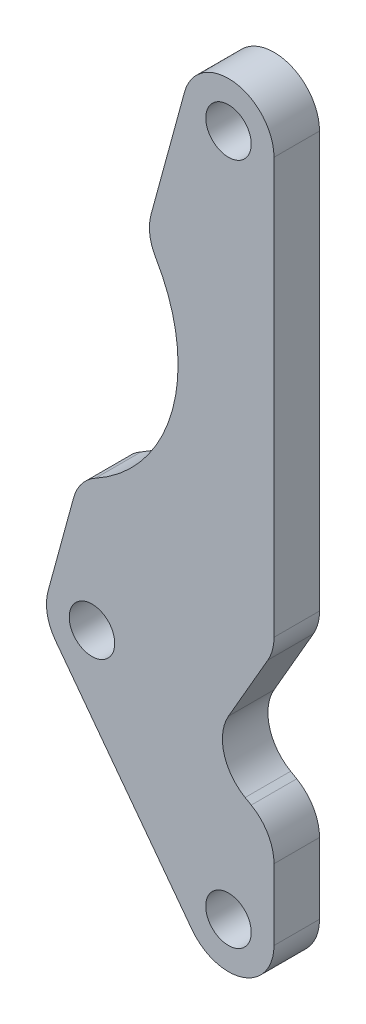
ISO-10303-21;
HEADER;
FILE_DESCRIPTION(('STEP AP214'),'2;1');
FILE_NAME('part.step','',(''),(''),'','','');
FILE_SCHEMA(('AUTOMOTIVE_DESIGN { 1 0 10303 214 1 1 1 1 }'));
ENDSEC;
DATA;
#1=APPLICATION_CONTEXT('core data for automotive mechanical design processes');
#2=APPLICATION_PROTOCOL_DEFINITION('international standard','automotive_design',2000,#1);
#3=PRODUCT_CONTEXT('',#1,'mechanical');
#4=PRODUCT('Part','Part','',(#3));
#5=PRODUCT_RELATED_PRODUCT_CATEGORY('part','',(#4));
#6=PRODUCT_DEFINITION_FORMATION('','',#4);
#7=PRODUCT_DEFINITION_CONTEXT('part definition',#1,'design');
#8=PRODUCT_DEFINITION('design','',#6,#7);
#9=PRODUCT_DEFINITION_SHAPE('','',#8);
#10=(LENGTH_UNIT() NAMED_UNIT(*) SI_UNIT(.MILLI.,.METRE.));
#11=(NAMED_UNIT(*) PLANE_ANGLE_UNIT() SI_UNIT($,.RADIAN.));
#12=(NAMED_UNIT(*) SI_UNIT($,.STERADIAN.) SOLID_ANGLE_UNIT());
#13=UNCERTAINTY_MEASURE_WITH_UNIT(LENGTH_MEASURE(1.E-05),#10,'distance_accuracy_value','');
#14=(GEOMETRIC_REPRESENTATION_CONTEXT(3) GLOBAL_UNCERTAINTY_ASSIGNED_CONTEXT((#13)) GLOBAL_UNIT_ASSIGNED_CONTEXT((#10,
#11,#12)) REPRESENTATION_CONTEXT('',''));
#15=CARTESIAN_POINT('',(0.,0.,0.));
#16=DIRECTION('',(0.,0.,1.));
#17=DIRECTION('',(1.,0.,0.));
#18=AXIS2_PLACEMENT_3D('',#15,#16,#17);
#19=CARTESIAN_POINT('',(-20.0545883369579,5.4694331828067,5.));
#20=DIRECTION('',(0.964763821237732,-0.263117405792109,0.));
#21=DIRECTION('',(0.263117405792109,0.964763821237732,0.));
#22=AXIS2_PLACEMENT_3D('',#19,#20,#21);
#23=PLANE('',#22);
#24=DIRECTION('',(-0.263117405792109,-0.964763821237732,0.));
#25=VECTOR('',#24,1.);
#26=CARTESIAN_POINT('',(-20.0545883369579,5.4694331828067,0.));
#27=LINE('',#26,#25);
#28=CARTESIAN_POINT('',(-4.82381910618866,61.3155870289606,0.));
#29=VERTEX_POINT('',#28);
#30=CARTESIAN_POINT('',(-8.51116880857213,47.7953047868878,0.));
#31=VERTEX_POINT('',#30);
#32=EDGE_CURVE('E208',#29,#31,#27,.T.);
#33=ORIENTED_EDGE('',*,*,#32,.T.);
#34=DIRECTION('',(0.,0.,1.));
#35=VECTOR('',#34,1.);
#36=CARTESIAN_POINT('',(-8.51116880857213,47.7953047868878,5.));
#37=LINE('',#36,#35);
#38=CARTESIAN_POINT('',(-8.51116880857213,47.7953047868878,5.));
#39=VERTEX_POINT('',#38);
#40=EDGE_CURVE('E11',#31,#39,#37,.T.);
#41=ORIENTED_EDGE('',*,*,#40,.T.);
#42=DIRECTION('',(-0.263117405792109,-0.964763821237732,0.));
#43=VECTOR('',#42,1.);
#44=CARTESIAN_POINT('',(-20.0545883369579,5.4694331828067,5.));
#45=LINE('',#44,#43);
#46=CARTESIAN_POINT('',(-4.82381910618866,61.3155870289606,5.));
#47=VERTEX_POINT('',#46);
#48=EDGE_CURVE('E184',#47,#39,#45,.T.);
#49=ORIENTED_EDGE('',*,*,#48,.F.);
#50=DIRECTION('',(0.,0.,-1.));
#51=VECTOR('',#50,1.);
#52=CARTESIAN_POINT('',(-4.82381910618866,61.3155870289606,5.));
#53=LINE('',#52,#51);
#54=EDGE_CURVE('E161',#47,#29,#53,.T.);
#55=ORIENTED_EDGE('',*,*,#54,.T.);
#56=EDGE_LOOP('',(#33,#41,#49,#55));
#57=FACE_BOUND('',#56,.T.);
#58=ADVANCED_FACE('F34',(#57),#23,.F.);
#59=CARTESIAN_POINT('',(5.,0.,5.));
#60=DIRECTION('',(1.,0.,0.));
#61=DIRECTION('',(0.,1.,0.));
#62=AXIS2_PLACEMENT_3D('',#59,#60,#61);
#63=PLANE('',#62);
#64=DIRECTION('',(0.,-1.,0.));
#65=VECTOR('',#64,1.);
#66=CARTESIAN_POINT('',(5.,0.,5.));
#67=LINE('',#66,#65);
#68=CARTESIAN_POINT('',(5.,60.,5.));
#69=VERTEX_POINT('',#68);
#70=CARTESIAN_POINT('',(5.,14.3301270189224,5.));
#71=VERTEX_POINT('',#70);
#72=EDGE_CURVE('E154',#69,#71,#67,.T.);
#73=ORIENTED_EDGE('',*,*,#72,.T.);
#74=DIRECTION('',(0.,0.,1.));
#75=VECTOR('',#74,1.);
#76=CARTESIAN_POINT('',(5.,14.3301270189224,0.));
#77=LINE('',#76,#75);
#78=CARTESIAN_POINT('',(5.,14.3301270189224,0.));
#79=VERTEX_POINT('',#78);
#80=EDGE_CURVE('E256',#71,#79,#77,.F.);
#81=ORIENTED_EDGE('',*,*,#80,.T.);
#82=DIRECTION('',(0.,-1.,0.));
#83=VECTOR('',#82,1.);
#84=CARTESIAN_POINT('',(5.,0.,0.));
#85=LINE('',#84,#83);
#86=CARTESIAN_POINT('',(5.,60.,0.));
#87=VERTEX_POINT('',#86);
#88=EDGE_CURVE('E157',#87,#79,#85,.T.);
#89=ORIENTED_EDGE('',*,*,#88,.F.);
#90=DIRECTION('',(0.,0.,-1.));
#91=VECTOR('',#90,1.);
#92=CARTESIAN_POINT('',(5.,60.,5.));
#93=LINE('',#92,#91);
#94=EDGE_CURVE('E150',#69,#87,#93,.T.);
#95=ORIENTED_EDGE('',*,*,#94,.F.);
#96=EDGE_LOOP('',(#73,#81,#89,#95));
#97=FACE_BOUND('',#96,.T.);
#98=ADVANCED_FACE('F152',(#97),#63,.T.);
#99=CARTESIAN_POINT('',(5.,-7.21687836487035,0.));
#100=VERTEX_POINT('',#99);
#101=CARTESIAN_POINT('',(5.,-15.,0.));
#102=VERTEX_POINT('',#101);
#103=EDGE_CURVE('E205',#100,#102,#85,.T.);
#104=ORIENTED_EDGE('',*,*,#103,.F.);
#105=DIRECTION('',(0.,0.,1.));
#106=VECTOR('',#105,1.);
#107=CARTESIAN_POINT('',(5.,-7.21687836487035,5.));
#108=LINE('',#107,#106);
#109=CARTESIAN_POINT('',(5.,-7.21687836487035,5.));
#110=VERTEX_POINT('',#109);
#111=EDGE_CURVE('E160',#100,#110,#108,.T.);
#112=ORIENTED_EDGE('',*,*,#111,.T.);
#113=CARTESIAN_POINT('',(5.,-15.,5.));
#114=VERTEX_POINT('',#113);
#115=EDGE_CURVE('E177',#110,#114,#67,.T.);
#116=ORIENTED_EDGE('',*,*,#115,.T.);
#117=DIRECTION('',(0.,0.,-1.));
#118=VECTOR('',#117,1.);
#119=CARTESIAN_POINT('',(5.,-15.,5.));
#120=LINE('',#119,#118);
#121=EDGE_CURVE('E202',#114,#102,#120,.T.);
#122=ORIENTED_EDGE('',*,*,#121,.T.);
#123=EDGE_LOOP('',(#104,#112,#116,#122));
#124=FACE_BOUND('',#123,.T.);
#125=ADVANCED_FACE('F307',(#124),#63,.T.);
#126=CARTESIAN_POINT('',(0.,60.,5.));
#127=DIRECTION('',(0.,0.,-1.));
#128=DIRECTION('',(-1.,0.,0.));
#129=AXIS2_PLACEMENT_3D('',#126,#127,#128);
#130=CYLINDRICAL_SURFACE('',#129,5.);
#131=CARTESIAN_POINT('',(0.,60.,0.));
#132=DIRECTION('',(0.,0.,1.));
#133=DIRECTION('',(1.,0.,0.));
#134=AXIS2_PLACEMENT_3D('',#131,#132,#133);
#135=CIRCLE('',#134,5.);
#136=EDGE_CURVE('E204',#87,#29,#135,.T.);
#137=ORIENTED_EDGE('',*,*,#136,.T.);
#138=ORIENTED_EDGE('',*,*,#54,.F.);
#139=CARTESIAN_POINT('',(0.,60.,5.));
#140=DIRECTION('',(0.,0.,1.));
#141=DIRECTION('',(1.,0.,0.));
#142=AXIS2_PLACEMENT_3D('',#139,#140,#141);
#143=CIRCLE('',#142,5.);
#144=EDGE_CURVE('E164',#69,#47,#143,.T.);
#145=ORIENTED_EDGE('',*,*,#144,.F.);
#146=ORIENTED_EDGE('',*,*,#94,.T.);
#147=EDGE_LOOP('',(#137,#138,#145,#146));
#148=FACE_BOUND('',#147,.T.);
#149=ADVANCED_FACE('F165',(#148),#130,.T.);
#150=CARTESIAN_POINT('',(-17.0187198954422,16.6009508016977,5.));
#151=VERTEX_POINT('',#150);
#152=CARTESIAN_POINT('',(-19.8238191061887,6.31558702896055,5.));
#153=VERTEX_POINT('',#152);
#154=EDGE_CURVE('E170',#151,#153,#45,.T.);
#155=ORIENTED_EDGE('',*,*,#154,.F.);
#156=DIRECTION('',(0.,0.,1.));
#157=VECTOR('',#156,1.);
#158=CARTESIAN_POINT('',(-17.0187198954422,16.6009508016977,5.));
#159=LINE('',#158,#157);
#160=CARTESIAN_POINT('',(-17.0187198954422,16.6009508016977,0.));
#161=VERTEX_POINT('',#160);
#162=EDGE_CURVE('E57',#151,#161,#159,.F.);
#163=ORIENTED_EDGE('',*,*,#162,.T.);
#164=CARTESIAN_POINT('',(-19.8238191061887,6.31558702896055,0.));
#165=VERTEX_POINT('',#164);
#166=EDGE_CURVE('E207',#161,#165,#27,.T.);
#167=ORIENTED_EDGE('',*,*,#166,.T.);
#168=DIRECTION('',(0.,0.,-1.));
#169=VECTOR('',#168,1.);
#170=CARTESIAN_POINT('',(-19.8238191061887,6.31558702896055,5.));
#171=LINE('',#170,#169);
#172=EDGE_CURVE('E233',#153,#165,#171,.T.);
#173=ORIENTED_EDGE('',*,*,#172,.F.);
#174=EDGE_LOOP('',(#155,#163,#167,#173));
#175=FACE_BOUND('',#174,.T.);
#176=ADVANCED_FACE('F289',(#175),#23,.F.);
#177=CARTESIAN_POINT('',(-15.,5.,5.));
#178=DIRECTION('',(0.,0.,-1.));
#179=DIRECTION('',(-1.,0.,0.));
#180=AXIS2_PLACEMENT_3D('',#177,#178,#179);
#181=CYLINDRICAL_SURFACE('',#180,5.);
#182=CARTESIAN_POINT('',(-15.,5.,0.));
#183=DIRECTION('',(0.,0.,1.));
#184=DIRECTION('',(1.,0.,0.));
#185=AXIS2_PLACEMENT_3D('',#182,#183,#184);
#186=CIRCLE('',#185,5.);
#187=CARTESIAN_POINT('',(-19.,2.,0.));
#188=VERTEX_POINT('',#187);
#189=EDGE_CURVE('E210',#165,#188,#186,.T.);
#190=ORIENTED_EDGE('',*,*,#189,.T.);
#191=DIRECTION('',(0.,0.,-1.));
#192=VECTOR('',#191,1.);
#193=CARTESIAN_POINT('',(-19.,2.,5.));
#194=LINE('',#193,#192);
#195=CARTESIAN_POINT('',(-19.,2.,5.));
#196=VERTEX_POINT('',#195);
#197=EDGE_CURVE('E230',#196,#188,#194,.T.);
#198=ORIENTED_EDGE('',*,*,#197,.F.);
#199=CARTESIAN_POINT('',(-15.,5.,5.));
#200=DIRECTION('',(0.,0.,1.));
#201=DIRECTION('',(1.,0.,0.));
#202=AXIS2_PLACEMENT_3D('',#199,#200,#201);
#203=CIRCLE('',#202,5.);
#204=EDGE_CURVE('E186',#153,#196,#203,.T.);
#205=ORIENTED_EDGE('',*,*,#204,.F.);
#206=ORIENTED_EDGE('',*,*,#172,.T.);
#207=EDGE_LOOP('',(#190,#198,#205,#206));
#208=FACE_BOUND('',#207,.T.);
#209=ADVANCED_FACE('F293',(#208),#181,.T.);
#210=CARTESIAN_POINT('',(-11.2,-8.4,5.));
#211=DIRECTION('',(0.8,0.6,0.));
#212=DIRECTION('',(-0.6,0.8,0.));
#213=AXIS2_PLACEMENT_3D('',#210,#211,#212);
#214=PLANE('',#213);
#215=DIRECTION('',(0.6,-0.8,0.));
#216=VECTOR('',#215,1.);
#217=CARTESIAN_POINT('',(-11.2,-8.4,0.));
#218=LINE('',#217,#216);
#219=CARTESIAN_POINT('',(-4.,-18.,0.));
#220=VERTEX_POINT('',#219);
#221=EDGE_CURVE('E212',#188,#220,#218,.T.);
#222=ORIENTED_EDGE('',*,*,#221,.T.);
#223=DIRECTION('',(0.,0.,-1.));
#224=VECTOR('',#223,1.);
#225=CARTESIAN_POINT('',(-4.,-18.,5.));
#226=LINE('',#225,#224);
#227=CARTESIAN_POINT('',(-4.,-18.,5.));
#228=VERTEX_POINT('',#227);
#229=EDGE_CURVE('E227',#228,#220,#226,.T.);
#230=ORIENTED_EDGE('',*,*,#229,.F.);
#231=DIRECTION('',(0.6,-0.8,0.));
#232=VECTOR('',#231,1.);
#233=CARTESIAN_POINT('',(-11.2,-8.4,5.));
#234=LINE('',#233,#232);
#235=EDGE_CURVE('E188',#196,#228,#234,.T.);
#236=ORIENTED_EDGE('',*,*,#235,.F.);
#237=ORIENTED_EDGE('',*,*,#197,.T.);
#238=EDGE_LOOP('',(#222,#230,#236,#237));
#239=FACE_BOUND('',#238,.T.);
#240=ADVANCED_FACE('F300',(#239),#214,.F.);
#241=CARTESIAN_POINT('',(-15.,5.,5.));
#242=DIRECTION('',(0.,0.,-1.));
#243=DIRECTION('',(-1.,0.,0.));
#244=AXIS2_PLACEMENT_3D('',#241,#242,#243);
#245=CYLINDRICAL_SURFACE('',#244,2.5);
#246=CARTESIAN_POINT('',(-15.,5.,5.));
#247=DIRECTION('',(0.,0.,1.));
#248=DIRECTION('',(1.,0.,0.));
#249=AXIS2_PLACEMENT_3D('',#246,#247,#248);
#250=CIRCLE('',#249,2.5);
#251=CARTESIAN_POINT('',(-12.5,5.,5.));
#252=VERTEX_POINT('',#251);
#253=EDGE_CURVE('E196',#252,#252,#250,.T.);
#254=ORIENTED_EDGE('',*,*,#253,.T.);
#255=EDGE_LOOP('',(#254));
#256=FACE_BOUND('',#255,.T.);
#257=CARTESIAN_POINT('',(-15.,5.,0.));
#258=DIRECTION('',(0.,0.,1.));
#259=DIRECTION('',(1.,0.,0.));
#260=AXIS2_PLACEMENT_3D('',#257,#258,#259);
#261=CIRCLE('',#260,2.5);
#262=CARTESIAN_POINT('',(-12.5,5.,0.));
#263=VERTEX_POINT('',#262);
#264=EDGE_CURVE('E220',#263,#263,#261,.T.);
#265=ORIENTED_EDGE('',*,*,#264,.F.);
#266=EDGE_LOOP('',(#265));
#267=FACE_BOUND('',#266,.T.);
#268=ADVANCED_FACE('F381',(#256,#267),#245,.F.);
#269=CARTESIAN_POINT('',(0.,-15.,5.));
#270=DIRECTION('',(0.,0.,-1.));
#271=DIRECTION('',(-1.,0.,0.));
#272=AXIS2_PLACEMENT_3D('',#269,#270,#271);
#273=CYLINDRICAL_SURFACE('',#272,2.5);
#274=CARTESIAN_POINT('',(0.,-15.,5.));
#275=DIRECTION('',(0.,0.,1.));
#276=DIRECTION('',(1.,0.,0.));
#277=AXIS2_PLACEMENT_3D('',#274,#275,#276);
#278=CIRCLE('',#277,2.5);
#279=CARTESIAN_POINT('',(2.5,-15.,5.));
#280=VERTEX_POINT('',#279);
#281=EDGE_CURVE('E193',#280,#280,#278,.T.);
#282=ORIENTED_EDGE('',*,*,#281,.T.);
#283=EDGE_LOOP('',(#282));
#284=FACE_BOUND('',#283,.T.);
#285=CARTESIAN_POINT('',(0.,-15.,0.));
#286=DIRECTION('',(0.,0.,1.));
#287=DIRECTION('',(1.,0.,0.));
#288=AXIS2_PLACEMENT_3D('',#285,#286,#287);
#289=CIRCLE('',#288,2.5);
#290=CARTESIAN_POINT('',(2.5,-15.,0.));
#291=VERTEX_POINT('',#290);
#292=EDGE_CURVE('E217',#291,#291,#289,.T.);
#293=ORIENTED_EDGE('',*,*,#292,.F.);
#294=EDGE_LOOP('',(#293));
#295=FACE_BOUND('',#294,.T.);
#296=ADVANCED_FACE('F384',(#284,#295),#273,.F.);
#297=CARTESIAN_POINT('',(0.,-15.,5.));
#298=DIRECTION('',(0.,0.,-1.));
#299=DIRECTION('',(-1.,0.,0.));
#300=AXIS2_PLACEMENT_3D('',#297,#298,#299);
#301=CYLINDRICAL_SURFACE('',#300,5.);
#302=CARTESIAN_POINT('',(0.,-15.,0.));
#303=DIRECTION('',(0.,0.,1.));
#304=DIRECTION('',(1.,0.,0.));
#305=AXIS2_PLACEMENT_3D('',#302,#303,#304);
#306=CIRCLE('',#305,5.);
#307=EDGE_CURVE('E214',#220,#102,#306,.T.);
#308=ORIENTED_EDGE('',*,*,#307,.T.);
#309=ORIENTED_EDGE('',*,*,#121,.F.);
#310=CARTESIAN_POINT('',(0.,-15.,5.));
#311=DIRECTION('',(0.,0.,1.));
#312=DIRECTION('',(1.,0.,0.));
#313=AXIS2_PLACEMENT_3D('',#310,#311,#312);
#314=CIRCLE('',#313,5.);
#315=EDGE_CURVE('E190',#228,#114,#314,.T.);
#316=ORIENTED_EDGE('',*,*,#315,.F.);
#317=ORIENTED_EDGE('',*,*,#229,.T.);
#318=EDGE_LOOP('',(#308,#309,#316,#317));
#319=FACE_BOUND('',#318,.T.);
#320=ADVANCED_FACE('F304',(#319),#301,.T.);
#321=CARTESIAN_POINT('',(0.,60.,5.));
#322=DIRECTION('',(0.,0.,-1.));
#323=DIRECTION('',(-1.,0.,0.));
#324=AXIS2_PLACEMENT_3D('',#321,#322,#323);
#325=CYLINDRICAL_SURFACE('',#324,2.5);
#326=CARTESIAN_POINT('',(0.,60.,5.));
#327=DIRECTION('',(0.,0.,1.));
#328=DIRECTION('',(1.,0.,0.));
#329=AXIS2_PLACEMENT_3D('',#326,#327,#328);
#330=CIRCLE('',#329,2.5);
#331=CARTESIAN_POINT('',(2.5,60.,5.));
#332=VERTEX_POINT('',#331);
#333=EDGE_CURVE('E199',#332,#332,#330,.T.);
#334=ORIENTED_EDGE('',*,*,#333,.T.);
#335=EDGE_LOOP('',(#334));
#336=FACE_BOUND('',#335,.T.);
#337=CARTESIAN_POINT('',(0.,60.,0.));
#338=DIRECTION('',(0.,0.,1.));
#339=DIRECTION('',(1.,0.,0.));
#340=AXIS2_PLACEMENT_3D('',#337,#338,#339);
#341=CIRCLE('',#340,2.5);
#342=CARTESIAN_POINT('',(2.5,60.,0.));
#343=VERTEX_POINT('',#342);
#344=EDGE_CURVE('E179',#343,#343,#341,.T.);
#345=ORIENTED_EDGE('',*,*,#344,.F.);
#346=EDGE_LOOP('',(#345));
#347=FACE_BOUND('',#346,.T.);
#348=ADVANCED_FACE('F375',(#336,#347),#325,.F.);
#349=CARTESIAN_POINT('',(0.,0.,5.));
#350=DIRECTION('',(0.,0.,1.));
#351=DIRECTION('',(1.,0.,0.));
#352=AXIS2_PLACEMENT_3D('',#349,#350,#351);
#353=PLANE('',#352);
#354=CARTESIAN_POINT('',(-23.0384757729337,35.,5.));
#355=DIRECTION('',(0.,0.,1.));
#356=DIRECTION('',(-1.,0.,0.));
#357=AXIS2_PLACEMENT_3D('',#354,#355,#356);
#358=CIRCLE('',#357,17.5);
#359=CARTESIAN_POINT('',(-14.6045841189602,19.6663940454622,5.));
#360=VERTEX_POINT('',#359);
#361=CARTESIAN_POINT('',(-7.98759994028352,43.9286693672768,5.));
#362=VERTEX_POINT('',#361);
#363=EDGE_CURVE('E285',#360,#362,#358,.T.);
#364=ORIENTED_EDGE('',*,*,#363,.F.);
#365=CARTESIAN_POINT('',(-12.1949007892535,15.2853637727371,5.));
#366=DIRECTION('',(0.,0.,1.));
#367=DIRECTION('',(1.,0.,0.));
#368=AXIS2_PLACEMENT_3D('',#365,#366,#367);
#369=CIRCLE('',#368,5.);
#370=EDGE_CURVE('E269',#360,#151,#369,.T.);
#371=ORIENTED_EDGE('',*,*,#370,.T.);
#372=ORIENTED_EDGE('',*,*,#154,.T.);
#373=ORIENTED_EDGE('',*,*,#204,.T.);
#374=ORIENTED_EDGE('',*,*,#235,.T.);
#375=ORIENTED_EDGE('',*,*,#315,.T.);
#376=ORIENTED_EDGE('',*,*,#115,.F.);
#377=CARTESIAN_POINT('',(0.,-7.21687836487035,5.));
#378=DIRECTION('',(0.,0.,1.));
#379=DIRECTION('',(1.,0.,0.));
#380=AXIS2_PLACEMENT_3D('',#377,#378,#379);
#381=CIRCLE('',#380,5.);
#382=CARTESIAN_POINT('',(2.50000000000002,-2.88675134594817,5.));
#383=VERTEX_POINT('',#382);
#384=EDGE_CURVE('E240',#110,#383,#381,.T.);
#385=ORIENTED_EDGE('',*,*,#384,.T.);
#386=DIRECTION('',(0.866025403784436,-0.500000000000004,0.));
#387=VECTOR('',#386,1.);
#388=CARTESIAN_POINT('',(5.,-4.33012701892224,5.));
#389=LINE('',#388,#387);
#390=CARTESIAN_POINT('',(1.83012701892214,-2.49999999999999,5.));
#391=VERTEX_POINT('',#390);
#392=EDGE_CURVE('E181',#391,#383,#389,.T.);
#393=ORIENTED_EDGE('',*,*,#392,.F.);
#394=CARTESIAN_POINT('',(4.33012701892216,1.83012701892219,5.));
#395=DIRECTION('',(0.,0.,1.));
#396=DIRECTION('',(1.,0.,0.));
#397=AXIS2_PLACEMENT_3D('',#394,#395,#396);
#398=CIRCLE('',#397,5.);
#399=CARTESIAN_POINT('',(0.,4.33012701892216,5.));
#400=VERTEX_POINT('',#399);
#401=EDGE_CURVE('E258',#391,#400,#398,.F.);
#402=ORIENTED_EDGE('',*,*,#401,.T.);
#403=DIRECTION('',(-0.499999999999995,-0.866025403784442,0.));
#404=VECTOR('',#403,1.);
#405=CARTESIAN_POINT('',(-2.5,0.,5.));
#406=LINE('',#405,#404);
#407=CARTESIAN_POINT('',(4.33012701892221,11.8301270189224,5.));
#408=VERTEX_POINT('',#407);
#409=EDGE_CURVE('E284',#408,#400,#406,.T.);
#410=ORIENTED_EDGE('',*,*,#409,.F.);
#411=CARTESIAN_POINT('',(0.,14.3301270189224,5.));
#412=DIRECTION('',(0.,0.,1.));
#413=DIRECTION('',(1.,0.,0.));
#414=AXIS2_PLACEMENT_3D('',#411,#412,#413);
#415=CIRCLE('',#414,5.);
#416=EDGE_CURVE('E176',#408,#71,#415,.T.);
#417=ORIENTED_EDGE('',*,*,#416,.T.);
#418=ORIENTED_EDGE('',*,*,#72,.F.);
#419=ORIENTED_EDGE('',*,*,#144,.T.);
#420=ORIENTED_EDGE('',*,*,#48,.T.);
#421=CARTESIAN_POINT('',(-3.68734970238347,46.4797177579273,5.));
#422=DIRECTION('',(0.,0.,1.));
#423=DIRECTION('',(1.,0.,0.));
#424=AXIS2_PLACEMENT_3D('',#421,#422,#423);
#425=CIRCLE('',#424,5.);
#426=EDGE_CURVE('E267',#39,#362,#425,.T.);
#427=ORIENTED_EDGE('',*,*,#426,.T.);
#428=EDGE_LOOP('',(#364,#371,#372,#373,#374,#375,#376,#385,#393,#402,#410,#417,#418,#419,#420,#427));
#429=FACE_BOUND('',#428,.T.);
#430=ORIENTED_EDGE('',*,*,#281,.F.);
#431=EDGE_LOOP('',(#430));
#432=FACE_BOUND('',#431,.T.);
#433=ORIENTED_EDGE('',*,*,#253,.F.);
#434=EDGE_LOOP('',(#433));
#435=FACE_BOUND('',#434,.T.);
#436=ORIENTED_EDGE('',*,*,#333,.F.);
#437=EDGE_LOOP('',(#436));
#438=FACE_BOUND('',#437,.T.);
#439=ADVANCED_FACE('F173',(#429,#432,#435,#438),#353,.T.);
#440=CARTESIAN_POINT('',(0.,0.,0.));
#441=DIRECTION('',(0.,0.,1.));
#442=DIRECTION('',(1.,0.,0.));
#443=AXIS2_PLACEMENT_3D('',#440,#441,#442);
#444=PLANE('',#443);
#445=ORIENTED_EDGE('',*,*,#166,.F.);
#446=CARTESIAN_POINT('',(-12.1949007892535,15.2853637727371,0.));
#447=DIRECTION('',(0.,0.,1.));
#448=DIRECTION('',(1.,0.,0.));
#449=AXIS2_PLACEMENT_3D('',#446,#447,#448);
#450=CIRCLE('',#449,5.);
#451=CARTESIAN_POINT('',(-14.6045841189602,19.6663940454622,0.));
#452=VERTEX_POINT('',#451);
#453=EDGE_CURVE('E42',#161,#452,#450,.F.);
#454=ORIENTED_EDGE('',*,*,#453,.T.);
#455=CARTESIAN_POINT('',(-23.0384757729337,35.,0.));
#456=DIRECTION('',(0.,0.,1.));
#457=DIRECTION('',(-1.,0.,0.));
#458=AXIS2_PLACEMENT_3D('',#455,#456,#457);
#459=CIRCLE('',#458,17.5);
#460=CARTESIAN_POINT('',(-7.98759994028352,43.9286693672768,0.));
#461=VERTEX_POINT('',#460);
#462=EDGE_CURVE('E276',#452,#461,#459,.T.);
#463=ORIENTED_EDGE('',*,*,#462,.T.);
#464=CARTESIAN_POINT('',(-3.68734970238347,46.4797177579273,0.));
#465=DIRECTION('',(0.,0.,1.));
#466=DIRECTION('',(1.,0.,0.));
#467=AXIS2_PLACEMENT_3D('',#464,#465,#466);
#468=CIRCLE('',#467,5.);
#469=EDGE_CURVE('E49',#461,#31,#468,.F.);
#470=ORIENTED_EDGE('',*,*,#469,.T.);
#471=ORIENTED_EDGE('',*,*,#32,.F.);
#472=ORIENTED_EDGE('',*,*,#136,.F.);
#473=ORIENTED_EDGE('',*,*,#88,.T.);
#474=CARTESIAN_POINT('',(0.,14.3301270189224,0.));
#475=DIRECTION('',(0.,0.,1.));
#476=DIRECTION('',(1.,0.,0.));
#477=AXIS2_PLACEMENT_3D('',#474,#475,#476);
#478=CIRCLE('',#477,5.);
#479=CARTESIAN_POINT('',(4.33012701892221,11.8301270189224,0.));
#480=VERTEX_POINT('',#479);
#481=EDGE_CURVE('E247',#79,#480,#478,.F.);
#482=ORIENTED_EDGE('',*,*,#481,.T.);
#483=DIRECTION('',(-0.499999999999995,-0.866025403784442,0.));
#484=VECTOR('',#483,1.);
#485=CARTESIAN_POINT('',(-2.5,0.,0.));
#486=LINE('',#485,#484);
#487=CARTESIAN_POINT('',(0.,4.33012701892216,0.));
#488=VERTEX_POINT('',#487);
#489=EDGE_CURVE('E318',#480,#488,#486,.T.);
#490=ORIENTED_EDGE('',*,*,#489,.T.);
#491=CARTESIAN_POINT('',(4.33012701892216,1.83012701892219,0.));
#492=DIRECTION('',(0.,0.,1.));
#493=DIRECTION('',(1.,0.,0.));
#494=AXIS2_PLACEMENT_3D('',#491,#492,#493);
#495=CIRCLE('',#494,5.);
#496=CARTESIAN_POINT('',(1.83012701892214,-2.49999999999999,0.));
#497=VERTEX_POINT('',#496);
#498=EDGE_CURVE('E260',#488,#497,#495,.T.);
#499=ORIENTED_EDGE('',*,*,#498,.T.);
#500=DIRECTION('',(0.866025403784436,-0.500000000000004,0.));
#501=VECTOR('',#500,1.);
#502=CARTESIAN_POINT('',(5.,-4.33012701892224,0.));
#503=LINE('',#502,#501);
#504=CARTESIAN_POINT('',(2.50000000000002,-2.88675134594817,0.));
#505=VERTEX_POINT('',#504);
#506=EDGE_CURVE('E321',#497,#505,#503,.T.);
#507=ORIENTED_EDGE('',*,*,#506,.T.);
#508=CARTESIAN_POINT('',(0.,-7.21687836487035,0.));
#509=DIRECTION('',(0.,0.,1.));
#510=DIRECTION('',(1.,0.,0.));
#511=AXIS2_PLACEMENT_3D('',#508,#509,#510);
#512=CIRCLE('',#511,5.);
#513=EDGE_CURVE('E249',#505,#100,#512,.F.);
#514=ORIENTED_EDGE('',*,*,#513,.T.);
#515=ORIENTED_EDGE('',*,*,#103,.T.);
#516=ORIENTED_EDGE('',*,*,#307,.F.);
#517=ORIENTED_EDGE('',*,*,#221,.F.);
#518=ORIENTED_EDGE('',*,*,#189,.F.);
#519=EDGE_LOOP('',(#445,#454,#463,#470,#471,#472,#473,#482,#490,#499,#507,#514,#515,#516,#517,#518));
#520=FACE_BOUND('',#519,.T.);
#521=ORIENTED_EDGE('',*,*,#292,.T.);
#522=EDGE_LOOP('',(#521));
#523=FACE_BOUND('',#522,.T.);
#524=ORIENTED_EDGE('',*,*,#264,.T.);
#525=EDGE_LOOP('',(#524));
#526=FACE_BOUND('',#525,.T.);
#527=ORIENTED_EDGE('',*,*,#344,.T.);
#528=EDGE_LOOP('',(#527));
#529=FACE_BOUND('',#528,.T.);
#530=ADVANCED_FACE('F274',(#520,#523,#526,#529),#444,.F.);
#531=CARTESIAN_POINT('',(-2.5,0.,0.));
#532=DIRECTION('',(-0.866025403784442,0.499999999999995,0.));
#533=DIRECTION('',(-0.499999999999995,-0.866025403784442,0.));
#534=AXIS2_PLACEMENT_3D('',#531,#532,#533);
#535=PLANE('',#534);
#536=ORIENTED_EDGE('',*,*,#489,.F.);
#537=DIRECTION('',(0.,0.,1.));
#538=VECTOR('',#537,1.);
#539=CARTESIAN_POINT('',(4.33012701892221,11.8301270189224,5.));
#540=LINE('',#539,#538);
#541=EDGE_CURVE('E253',#480,#408,#540,.T.);
#542=ORIENTED_EDGE('',*,*,#541,.T.);
#543=ORIENTED_EDGE('',*,*,#409,.T.);
#544=DIRECTION('',(0.,0.,1.));
#545=VECTOR('',#544,1.);
#546=CARTESIAN_POINT('',(0.,4.33012701892216,0.));
#547=LINE('',#546,#545);
#548=EDGE_CURVE('E251',#400,#488,#547,.F.);
#549=ORIENTED_EDGE('',*,*,#548,.T.);
#550=EDGE_LOOP('',(#536,#542,#543,#549));
#551=FACE_BOUND('',#550,.T.);
#552=ADVANCED_FACE('F331',(#551),#535,.F.);
#553=CARTESIAN_POINT('',(5.,-4.33012701892224,0.));
#554=DIRECTION('',(-0.500000000000004,-0.866025403784436,0.));
#555=DIRECTION('',(0.866025403784436,-0.500000000000004,0.));
#556=AXIS2_PLACEMENT_3D('',#553,#554,#555);
#557=PLANE('',#556);
#558=ORIENTED_EDGE('',*,*,#392,.T.);
#559=DIRECTION('',(0.,0.,1.));
#560=VECTOR('',#559,1.);
#561=CARTESIAN_POINT('',(2.50000000000002,-2.88675134594817,0.));
#562=LINE('',#561,#560);
#563=EDGE_CURVE('E245',#383,#505,#562,.F.);
#564=ORIENTED_EDGE('',*,*,#563,.T.);
#565=ORIENTED_EDGE('',*,*,#506,.F.);
#566=DIRECTION('',(0.,0.,1.));
#567=VECTOR('',#566,1.);
#568=CARTESIAN_POINT('',(1.83012701892214,-2.49999999999999,5.));
#569=LINE('',#568,#567);
#570=EDGE_CURVE('E242',#497,#391,#569,.T.);
#571=ORIENTED_EDGE('',*,*,#570,.T.);
#572=EDGE_LOOP('',(#558,#564,#565,#571));
#573=FACE_BOUND('',#572,.T.);
#574=ADVANCED_FACE('F314',(#573),#557,.F.);
#575=CARTESIAN_POINT('',(0.,-7.21687836487035,5.));
#576=DIRECTION('',(0.,0.,-1.));
#577=DIRECTION('',(-1.,0.,0.));
#578=AXIS2_PLACEMENT_3D('',#575,#576,#577);
#579=CYLINDRICAL_SURFACE('',#578,5.);
#580=ORIENTED_EDGE('',*,*,#513,.F.);
#581=ORIENTED_EDGE('',*,*,#563,.F.);
#582=ORIENTED_EDGE('',*,*,#384,.F.);
#583=ORIENTED_EDGE('',*,*,#111,.F.);
#584=EDGE_LOOP('',(#580,#581,#582,#583));
#585=FACE_BOUND('',#584,.T.);
#586=ADVANCED_FACE('F320',(#585),#579,.T.);
#587=CARTESIAN_POINT('',(0.,14.3301270189224,0.));
#588=DIRECTION('',(0.,0.,-1.));
#589=DIRECTION('',(-1.,0.,0.));
#590=AXIS2_PLACEMENT_3D('',#587,#588,#589);
#591=CYLINDRICAL_SURFACE('',#590,5.);
#592=ORIENTED_EDGE('',*,*,#481,.F.);
#593=ORIENTED_EDGE('',*,*,#80,.F.);
#594=ORIENTED_EDGE('',*,*,#416,.F.);
#595=ORIENTED_EDGE('',*,*,#541,.F.);
#596=EDGE_LOOP('',(#592,#593,#594,#595));
#597=FACE_BOUND('',#596,.T.);
#598=ADVANCED_FACE('F336',(#597),#591,.T.);
#599=CARTESIAN_POINT('',(4.33012701892216,1.83012701892219,0.));
#600=DIRECTION('',(0.,0.,-1.));
#601=DIRECTION('',(-1.,0.,0.));
#602=AXIS2_PLACEMENT_3D('',#599,#600,#601);
#603=CYLINDRICAL_SURFACE('',#602,5.);
#604=ORIENTED_EDGE('',*,*,#498,.F.);
#605=ORIENTED_EDGE('',*,*,#548,.F.);
#606=ORIENTED_EDGE('',*,*,#401,.F.);
#607=ORIENTED_EDGE('',*,*,#570,.F.);
#608=EDGE_LOOP('',(#604,#605,#606,#607));
#609=FACE_BOUND('',#608,.T.);
#610=ADVANCED_FACE('F334',(#609),#603,.F.);
#611=CARTESIAN_POINT('',(-23.0384757729337,35.,0.));
#612=DIRECTION('',(0.,0.,1.));
#613=DIRECTION('',(1.,0.,0.));
#614=AXIS2_PLACEMENT_3D('',#611,#612,#613);
#615=CYLINDRICAL_SURFACE('',#614,17.5);
#616=ORIENTED_EDGE('',*,*,#462,.F.);
#617=DIRECTION('',(0.,0.,1.));
#618=VECTOR('',#617,1.);
#619=CARTESIAN_POINT('',(-14.6045841189602,19.6663940454622,0.));
#620=LINE('',#619,#618);
#621=EDGE_CURVE('E264',#452,#360,#620,.T.);
#622=ORIENTED_EDGE('',*,*,#621,.T.);
#623=ORIENTED_EDGE('',*,*,#363,.T.);
#624=DIRECTION('',(0.,0.,1.));
#625=VECTOR('',#624,1.);
#626=CARTESIAN_POINT('',(-7.98759994028352,43.9286693672768,0.));
#627=LINE('',#626,#625);
#628=EDGE_CURVE('E262',#362,#461,#627,.F.);
#629=ORIENTED_EDGE('',*,*,#628,.T.);
#630=EDGE_LOOP('',(#616,#622,#623,#629));
#631=FACE_BOUND('',#630,.T.);
#632=ADVANCED_FACE('F281',(#631),#615,.F.);
#633=CARTESIAN_POINT('',(-12.1949007892535,15.2853637727371,0.));
#634=DIRECTION('',(0.,0.,1.));
#635=DIRECTION('',(1.,0.,0.));
#636=AXIS2_PLACEMENT_3D('',#633,#634,#635);
#637=CYLINDRICAL_SURFACE('',#636,5.);
#638=ORIENTED_EDGE('',*,*,#453,.F.);
#639=ORIENTED_EDGE('',*,*,#162,.F.);
#640=ORIENTED_EDGE('',*,*,#370,.F.);
#641=ORIENTED_EDGE('',*,*,#621,.F.);
#642=EDGE_LOOP('',(#638,#639,#640,#641));
#643=FACE_BOUND('',#642,.T.);
#644=ADVANCED_FACE('F287',(#643),#637,.T.);
#645=CARTESIAN_POINT('',(-3.68734970238347,46.4797177579273,0.));
#646=DIRECTION('',(0.,0.,1.));
#647=DIRECTION('',(1.,0.,0.));
#648=AXIS2_PLACEMENT_3D('',#645,#646,#647);
#649=CYLINDRICAL_SURFACE('',#648,5.);
#650=ORIENTED_EDGE('',*,*,#469,.F.);
#651=ORIENTED_EDGE('',*,*,#628,.F.);
#652=ORIENTED_EDGE('',*,*,#426,.F.);
#653=ORIENTED_EDGE('',*,*,#40,.F.);
#654=EDGE_LOOP('',(#650,#651,#652,#653));
#655=FACE_BOUND('',#654,.T.);
#656=ADVANCED_FACE('F36',(#655),#649,.T.);
#657=CLOSED_SHELL('',(#58,#98,#125,#149,#176,#209,#240,#268,#296,#320,#348,#439,#530,#552,#574,
#586,#598,#610,#632,#644,#656));
#658=MANIFOLD_SOLID_BREP('B2',#657);
#659=ADVANCED_BREP_SHAPE_REPRESENTATION('',(#18,#658),#14);
#660=SHAPE_DEFINITION_REPRESENTATION(#9,#659);
ENDSEC;
END-ISO-10303-21;
